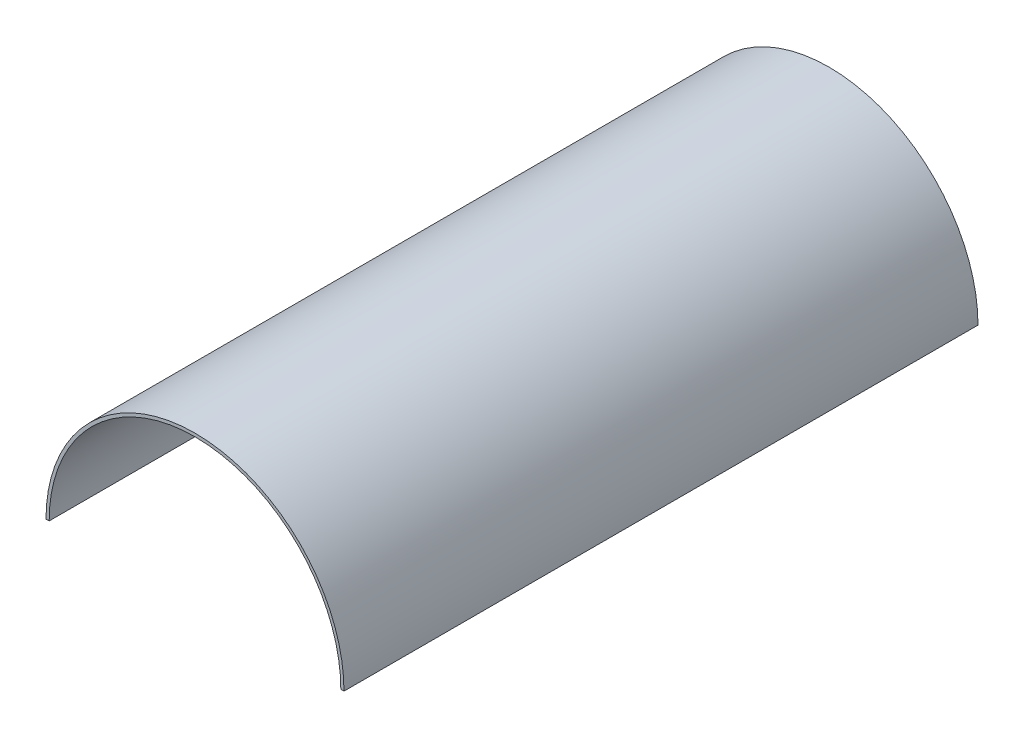
ISO-10303-21;
HEADER;
FILE_DESCRIPTION(('STEP AP214'),'2;1');
FILE_NAME('part.step','',(''),(''),'','','');
FILE_SCHEMA(('AUTOMOTIVE_DESIGN { 1 0 10303 214 1 1 1 1 }'));
ENDSEC;
DATA;
#1=APPLICATION_CONTEXT('core data for automotive mechanical design processes');
#2=APPLICATION_PROTOCOL_DEFINITION('international standard','automotive_design',2000,#1);
#3=PRODUCT_CONTEXT('',#1,'mechanical');
#4=PRODUCT('Part','Part','',(#3));
#5=PRODUCT_RELATED_PRODUCT_CATEGORY('part','',(#4));
#6=PRODUCT_DEFINITION_FORMATION('','',#4);
#7=PRODUCT_DEFINITION_CONTEXT('part definition',#1,'design');
#8=PRODUCT_DEFINITION('design','',#6,#7);
#9=PRODUCT_DEFINITION_SHAPE('','',#8);
#10=(LENGTH_UNIT() NAMED_UNIT(*) SI_UNIT(.MILLI.,.METRE.));
#11=(NAMED_UNIT(*) PLANE_ANGLE_UNIT() SI_UNIT($,.RADIAN.));
#12=(NAMED_UNIT(*) SI_UNIT($,.STERADIAN.) SOLID_ANGLE_UNIT());
#13=UNCERTAINTY_MEASURE_WITH_UNIT(LENGTH_MEASURE(1.E-05),#10,'distance_accuracy_value','');
#14=(GEOMETRIC_REPRESENTATION_CONTEXT(3) GLOBAL_UNCERTAINTY_ASSIGNED_CONTEXT((#13)) GLOBAL_UNIT_ASSIGNED_CONTEXT((#10,
#11,#12)) REPRESENTATION_CONTEXT('',''));
#15=CARTESIAN_POINT('',(0.,0.,0.));
#16=DIRECTION('',(0.,0.,1.));
#17=DIRECTION('',(1.,0.,0.));
#18=AXIS2_PLACEMENT_3D('',#15,#16,#17);
#19=CARTESIAN_POINT('',(0.,0.,100.));
#20=DIRECTION('',(0.,0.,1.));
#21=DIRECTION('',(1.,0.,0.));
#22=AXIS2_PLACEMENT_3D('',#19,#20,#21);
#23=PLANE('',#22);
#24=CARTESIAN_POINT('',(0.,0.,100.));
#25=DIRECTION('',(0.,0.,1.));
#26=DIRECTION('',(1.,0.,0.));
#27=AXIS2_PLACEMENT_3D('',#24,#25,#26);
#28=CIRCLE('',#27,23.5);
#29=CARTESIAN_POINT('',(23.5,0.,100.));
#30=VERTEX_POINT('',#29);
#31=CARTESIAN_POINT('',(-23.5,0.,100.));
#32=VERTEX_POINT('',#31);
#33=EDGE_CURVE('E77',#30,#32,#28,.T.);
#34=ORIENTED_EDGE('',*,*,#33,.T.);
#35=DIRECTION('',(1.,0.,0.));
#36=VECTOR('',#35,1.);
#37=CARTESIAN_POINT('',(0.,0.,100.));
#38=LINE('',#37,#36);
#39=CARTESIAN_POINT('',(-23.,0.,100.));
#40=VERTEX_POINT('',#39);
#41=EDGE_CURVE('E91',#32,#40,#38,.T.);
#42=ORIENTED_EDGE('',*,*,#41,.T.);
#43=CARTESIAN_POINT('',(0.,0.,100.));
#44=DIRECTION('',(0.,0.,1.));
#45=DIRECTION('',(1.,0.,0.));
#46=AXIS2_PLACEMENT_3D('',#43,#44,#45);
#47=CIRCLE('',#46,23.);
#48=CARTESIAN_POINT('',(23.,0.,100.));
#49=VERTEX_POINT('',#48);
#50=EDGE_CURVE('E87',#49,#40,#47,.T.);
#51=ORIENTED_EDGE('',*,*,#50,.F.);
#52=EDGE_CURVE('E54',#49,#30,#38,.T.);
#53=ORIENTED_EDGE('',*,*,#52,.T.);
#54=EDGE_LOOP('',(#34,#42,#51,#53));
#55=FACE_BOUND('',#54,.T.);
#56=ADVANCED_FACE('F32',(#55),#23,.T.);
#57=CARTESIAN_POINT('',(0.,0.,0.));
#58=DIRECTION('',(0.,0.,1.));
#59=DIRECTION('',(1.,0.,0.));
#60=AXIS2_PLACEMENT_3D('',#57,#58,#59);
#61=PLANE('',#60);
#62=DIRECTION('',(1.,0.,0.));
#63=VECTOR('',#62,1.);
#64=CARTESIAN_POINT('',(0.,0.,0.));
#65=LINE('',#64,#63);
#66=CARTESIAN_POINT('',(-23.5,0.,0.));
#67=VERTEX_POINT('',#66);
#68=CARTESIAN_POINT('',(-23.,0.,0.));
#69=VERTEX_POINT('',#68);
#70=EDGE_CURVE('E47',#67,#69,#65,.T.);
#71=ORIENTED_EDGE('',*,*,#70,.F.);
#72=CARTESIAN_POINT('',(0.,0.,0.));
#73=DIRECTION('',(0.,0.,1.));
#74=DIRECTION('',(1.,0.,0.));
#75=AXIS2_PLACEMENT_3D('',#72,#73,#74);
#76=CIRCLE('',#75,23.5);
#77=CARTESIAN_POINT('',(23.5,0.,0.));
#78=VERTEX_POINT('',#77);
#79=EDGE_CURVE('E84',#78,#67,#76,.T.);
#80=ORIENTED_EDGE('',*,*,#79,.F.);
#81=CARTESIAN_POINT('',(23.,0.,0.));
#82=VERTEX_POINT('',#81);
#83=EDGE_CURVE('E71',#82,#78,#65,.T.);
#84=ORIENTED_EDGE('',*,*,#83,.F.);
#85=CARTESIAN_POINT('',(0.,0.,0.));
#86=DIRECTION('',(0.,0.,1.));
#87=DIRECTION('',(1.,0.,0.));
#88=AXIS2_PLACEMENT_3D('',#85,#86,#87);
#89=CIRCLE('',#88,23.);
#90=EDGE_CURVE('E82',#82,#69,#89,.T.);
#91=ORIENTED_EDGE('',*,*,#90,.T.);
#92=EDGE_LOOP('',(#71,#80,#84,#91));
#93=FACE_BOUND('',#92,.T.);
#94=ADVANCED_FACE('F81',(#93),#61,.F.);
#95=CARTESIAN_POINT('',(0.,0.,100.));
#96=DIRECTION('',(0.,0.,-1.));
#97=DIRECTION('',(-1.,0.,0.));
#98=AXIS2_PLACEMENT_3D('',#95,#96,#97);
#99=CYLINDRICAL_SURFACE('',#98,23.5);
#100=DIRECTION('',(0.,0.,-1.));
#101=VECTOR('',#100,1.);
#102=CARTESIAN_POINT('',(-23.5,0.,100.));
#103=LINE('',#102,#101);
#104=EDGE_CURVE('E88',#32,#67,#103,.T.);
#105=ORIENTED_EDGE('',*,*,#104,.F.);
#106=ORIENTED_EDGE('',*,*,#33,.F.);
#107=DIRECTION('',(0.,0.,-1.));
#108=VECTOR('',#107,1.);
#109=CARTESIAN_POINT('',(23.5,0.,100.));
#110=LINE('',#109,#108);
#111=EDGE_CURVE('E99',#78,#30,#110,.F.);
#112=ORIENTED_EDGE('',*,*,#111,.F.);
#113=ORIENTED_EDGE('',*,*,#79,.T.);
#114=EDGE_LOOP('',(#105,#106,#112,#113));
#115=FACE_BOUND('',#114,.T.);
#116=ADVANCED_FACE('F34',(#115),#99,.T.);
#117=CARTESIAN_POINT('',(0.,0.,100.));
#118=DIRECTION('',(0.,0.,-1.));
#119=DIRECTION('',(-1.,0.,0.));
#120=AXIS2_PLACEMENT_3D('',#117,#118,#119);
#121=CYLINDRICAL_SURFACE('',#120,23.);
#122=ORIENTED_EDGE('',*,*,#50,.T.);
#123=DIRECTION('',(0.,0.,-1.));
#124=VECTOR('',#123,1.);
#125=CARTESIAN_POINT('',(-23.,0.,100.));
#126=LINE('',#125,#124);
#127=EDGE_CURVE('E11',#40,#69,#126,.T.);
#128=ORIENTED_EDGE('',*,*,#127,.T.);
#129=ORIENTED_EDGE('',*,*,#90,.F.);
#130=DIRECTION('',(0.,0.,-1.));
#131=VECTOR('',#130,1.);
#132=CARTESIAN_POINT('',(23.,0.,100.));
#133=LINE('',#132,#131);
#134=EDGE_CURVE('E40',#82,#49,#133,.F.);
#135=ORIENTED_EDGE('',*,*,#134,.T.);
#136=EDGE_LOOP('',(#122,#128,#129,#135));
#137=FACE_BOUND('',#136,.T.);
#138=ADVANCED_FACE('F86',(#137),#121,.F.);
#139=CARTESIAN_POINT('',(0.,0.,0.));
#140=DIRECTION('',(0.,-1.,0.));
#141=DIRECTION('',(0.,0.,-1.));
#142=AXIS2_PLACEMENT_3D('',#139,#140,#141);
#143=PLANE('',#142);
#144=ORIENTED_EDGE('',*,*,#111,.T.);
#145=ORIENTED_EDGE('',*,*,#52,.F.);
#146=ORIENTED_EDGE('',*,*,#134,.F.);
#147=ORIENTED_EDGE('',*,*,#83,.T.);
#148=EDGE_LOOP('',(#144,#145,#146,#147));
#149=FACE_BOUND('',#148,.T.);
#150=ADVANCED_FACE('F70',(#149),#143,.T.);
#151=ORIENTED_EDGE('',*,*,#104,.T.);
#152=ORIENTED_EDGE('',*,*,#70,.T.);
#153=ORIENTED_EDGE('',*,*,#127,.F.);
#154=ORIENTED_EDGE('',*,*,#41,.F.);
#155=EDGE_LOOP('',(#151,#152,#153,#154));
#156=FACE_BOUND('',#155,.T.);
#157=ADVANCED_FACE('F104',(#156),#143,.T.);
#158=CLOSED_SHELL('',(#56,#94,#116,#138,#150,#157));
#159=MANIFOLD_SOLID_BREP('B2',#158);
#160=ADVANCED_BREP_SHAPE_REPRESENTATION('',(#18,#159),#14);
#161=SHAPE_DEFINITION_REPRESENTATION(#9,#160);
ENDSEC;
END-ISO-10303-21;
